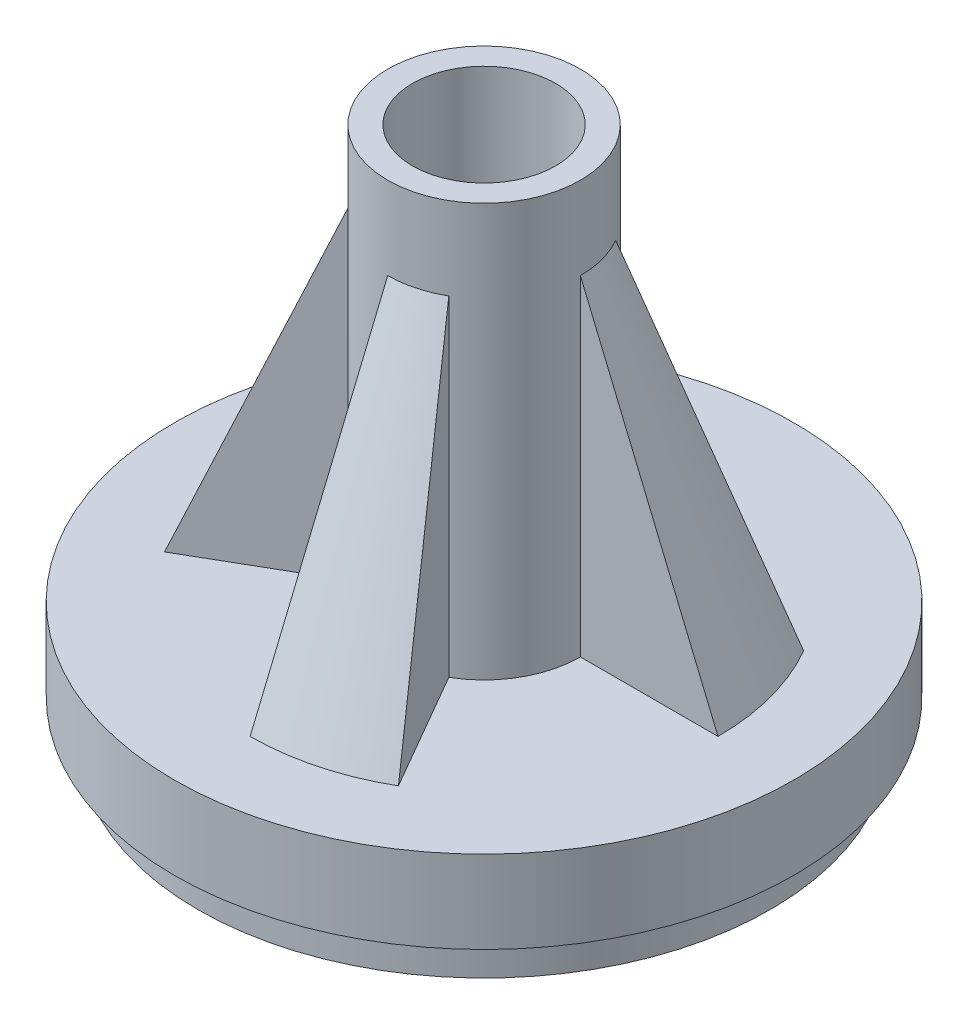
ISO-10303-21;
HEADER;
FILE_DESCRIPTION(('STEP AP214'),'2;1');
FILE_NAME('part.step','',(''),(''),'','','');
FILE_SCHEMA(('AUTOMOTIVE_DESIGN { 1 0 10303 214 1 1 1 1 }'));
ENDSEC;
DATA;
#1=APPLICATION_CONTEXT('core data for automotive mechanical design processes');
#2=APPLICATION_PROTOCOL_DEFINITION('international standard','automotive_design',2000,#1);
#3=PRODUCT_CONTEXT('',#1,'mechanical');
#4=PRODUCT('Part','Part','',(#3));
#5=PRODUCT_RELATED_PRODUCT_CATEGORY('part','',(#4));
#6=PRODUCT_DEFINITION_FORMATION('','',#4);
#7=PRODUCT_DEFINITION_CONTEXT('part definition',#1,'design');
#8=PRODUCT_DEFINITION('design','',#6,#7);
#9=PRODUCT_DEFINITION_SHAPE('','',#8);
#10=(LENGTH_UNIT() NAMED_UNIT(*) SI_UNIT(.MILLI.,.METRE.));
#11=(NAMED_UNIT(*) PLANE_ANGLE_UNIT() SI_UNIT($,.RADIAN.));
#12=(NAMED_UNIT(*) SI_UNIT($,.STERADIAN.) SOLID_ANGLE_UNIT());
#13=UNCERTAINTY_MEASURE_WITH_UNIT(LENGTH_MEASURE(1.E-05),#10,'distance_accuracy_value','');
#14=(GEOMETRIC_REPRESENTATION_CONTEXT(3) GLOBAL_UNCERTAINTY_ASSIGNED_CONTEXT((#13)) GLOBAL_UNIT_ASSIGNED_CONTEXT((#10,
#11,#12)) REPRESENTATION_CONTEXT('',''));
#15=CARTESIAN_POINT('',(0.,0.,0.));
#16=DIRECTION('',(0.,0.,1.));
#17=DIRECTION('',(1.,0.,0.));
#18=AXIS2_PLACEMENT_3D('',#15,#16,#17);
#19=CARTESIAN_POINT('',(0.,4.5,0.));
#20=DIRECTION('',(0.,1.,0.));
#21=DIRECTION('',(0.,0.,1.));
#22=AXIS2_PLACEMENT_3D('',#19,#20,#21);
#23=PLANE('',#22);
#24=CARTESIAN_POINT('',(0.,4.5,0.));
#25=DIRECTION('',(0.,1.,0.));
#26=DIRECTION('',(0.,0.,1.));
#27=AXIS2_PLACEMENT_3D('',#24,#25,#26);
#28=CIRCLE('',#27,11.25);
#29=CARTESIAN_POINT('',(0.,4.5,11.25));
#30=VERTEX_POINT('',#29);
#31=EDGE_CURVE('E185',#30,#30,#28,.T.);
#32=ORIENTED_EDGE('',*,*,#31,.T.);
#33=EDGE_LOOP('',(#32));
#34=FACE_BOUND('',#33,.T.);
#35=CARTESIAN_POINT('',(0.,4.5,0.));
#36=DIRECTION('',(0.,1.,0.));
#37=DIRECTION('',(0.,0.,1.));
#38=AXIS2_PLACEMENT_3D('',#35,#36,#37);
#39=CIRCLE('',#38,3.5);
#40=CARTESIAN_POINT('',(3.03108891324553,4.5,-1.75));
#41=VERTEX_POINT('',#40);
#42=CARTESIAN_POINT('',(0.,4.5,-3.5));
#43=VERTEX_POINT('',#42);
#44=EDGE_CURVE('E160',#41,#43,#39,.T.);
#45=ORIENTED_EDGE('',*,*,#44,.F.);
#46=DIRECTION('',(0.866025403784438,0.,-0.500000000000001));
#47=VECTOR('',#46,1.);
#48=CARTESIAN_POINT('',(3.03108891324553,4.5,-1.75));
#49=LINE('',#48,#47);
#50=CARTESIAN_POINT('',(7.36121593216772,4.5,-4.25000000000001));
#51=VERTEX_POINT('',#50);
#52=EDGE_CURVE('E416',#41,#51,#49,.T.);
#53=ORIENTED_EDGE('',*,*,#52,.T.);
#54=CARTESIAN_POINT('',(0.,4.5,0.));
#55=DIRECTION('',(0.,-1.,0.));
#56=DIRECTION('',(0.,0.,-1.));
#57=AXIS2_PLACEMENT_3D('',#54,#55,#56);
#58=CIRCLE('',#57,8.5);
#59=CARTESIAN_POINT('',(8.5,4.5,0.));
#60=VERTEX_POINT('',#59);
#61=EDGE_CURVE('E153',#51,#60,#58,.T.);
#62=ORIENTED_EDGE('',*,*,#61,.T.);
#63=DIRECTION('',(1.,0.,0.));
#64=VECTOR('',#63,1.);
#65=CARTESIAN_POINT('',(3.5,4.5,0.));
#66=LINE('',#65,#64);
#67=CARTESIAN_POINT('',(3.5,4.5,0.));
#68=VERTEX_POINT('',#67);
#69=EDGE_CURVE('E138',#68,#60,#66,.T.);
#70=ORIENTED_EDGE('',*,*,#69,.F.);
#71=CARTESIAN_POINT('',(1.75,4.5,3.03108891324553));
#72=VERTEX_POINT('',#71);
#73=EDGE_CURVE('E150',#72,#68,#39,.T.);
#74=ORIENTED_EDGE('',*,*,#73,.F.);
#75=DIRECTION('',(-0.500000000000001,0.,-0.866025403784438));
#76=VECTOR('',#75,1.);
#77=CARTESIAN_POINT('',(0.,4.5,0.));
#78=LINE('',#77,#76);
#79=CARTESIAN_POINT('',(4.25000000000001,4.5,7.36121593216772));
#80=VERTEX_POINT('',#79);
#81=EDGE_CURVE('E470',#80,#72,#78,.T.);
#82=ORIENTED_EDGE('',*,*,#81,.F.);
#83=CARTESIAN_POINT('',(0.,4.5,0.));
#84=DIRECTION('',(0.,-1.,0.));
#85=DIRECTION('',(0.,0.,-1.));
#86=AXIS2_PLACEMENT_3D('',#83,#84,#85);
#87=CIRCLE('',#86,8.5);
#88=CARTESIAN_POINT('',(0.,4.5,8.5));
#89=VERTEX_POINT('',#88);
#90=EDGE_CURVE('E476',#80,#89,#87,.T.);
#91=ORIENTED_EDGE('',*,*,#90,.T.);
#92=DIRECTION('',(0.,0.,-1.));
#93=VECTOR('',#92,1.);
#94=CARTESIAN_POINT('',(0.,4.5,0.));
#95=LINE('',#94,#93);
#96=CARTESIAN_POINT('',(0.,4.5,3.5));
#97=VERTEX_POINT('',#96);
#98=EDGE_CURVE('E421',#89,#97,#95,.T.);
#99=ORIENTED_EDGE('',*,*,#98,.T.);
#100=CARTESIAN_POINT('',(-3.03108891324553,4.5,1.75));
#101=VERTEX_POINT('',#100);
#102=EDGE_CURVE('E163',#101,#97,#39,.T.);
#103=ORIENTED_EDGE('',*,*,#102,.F.);
#104=DIRECTION('',(0.866025403784438,0.,-0.500000000000001));
#105=VECTOR('',#104,1.);
#106=CARTESIAN_POINT('',(-3.03108891324553,4.5,1.75));
#107=LINE('',#106,#105);
#108=CARTESIAN_POINT('',(-7.36121593216772,4.5,4.25000000000001));
#109=VERTEX_POINT('',#108);
#110=EDGE_CURVE('E62',#109,#101,#107,.T.);
#111=ORIENTED_EDGE('',*,*,#110,.F.);
#112=CARTESIAN_POINT('',(0.,4.5,0.));
#113=DIRECTION('',(0.,-1.,0.));
#114=DIRECTION('',(0.,0.,-1.));
#115=AXIS2_PLACEMENT_3D('',#112,#113,#114);
#116=CIRCLE('',#115,8.5);
#117=CARTESIAN_POINT('',(-8.5,4.5,0.));
#118=VERTEX_POINT('',#117);
#119=EDGE_CURVE('E66',#109,#118,#116,.T.);
#120=ORIENTED_EDGE('',*,*,#119,.T.);
#121=DIRECTION('',(1.,0.,0.));
#122=VECTOR('',#121,1.);
#123=CARTESIAN_POINT('',(-3.5,4.5,0.));
#124=LINE('',#123,#122);
#125=CARTESIAN_POINT('',(-3.5,4.5,0.));
#126=VERTEX_POINT('',#125);
#127=EDGE_CURVE('E425',#118,#126,#124,.T.);
#128=ORIENTED_EDGE('',*,*,#127,.T.);
#129=CARTESIAN_POINT('',(-1.75,4.5,-3.03108891324553));
#130=VERTEX_POINT('',#129);
#131=EDGE_CURVE('E162',#130,#126,#39,.T.);
#132=ORIENTED_EDGE('',*,*,#131,.F.);
#133=DIRECTION('',(0.500000000000001,0.,0.866025403784438));
#134=VECTOR('',#133,1.);
#135=CARTESIAN_POINT('',(0.,4.5,0.));
#136=LINE('',#135,#134);
#137=CARTESIAN_POINT('',(-4.25000000000001,4.5,-7.36121593216773));
#138=VERTEX_POINT('',#137);
#139=EDGE_CURVE('E454',#138,#130,#136,.T.);
#140=ORIENTED_EDGE('',*,*,#139,.F.);
#141=CARTESIAN_POINT('',(0.,4.5,0.));
#142=DIRECTION('',(0.,-1.,0.));
#143=DIRECTION('',(0.,0.,-1.));
#144=AXIS2_PLACEMENT_3D('',#141,#142,#143);
#145=CIRCLE('',#144,8.5);
#146=CARTESIAN_POINT('',(0.,4.5,-8.5));
#147=VERTEX_POINT('',#146);
#148=EDGE_CURVE('E177',#138,#147,#145,.T.);
#149=ORIENTED_EDGE('',*,*,#148,.T.);
#150=DIRECTION('',(0.,0.,1.));
#151=VECTOR('',#150,1.);
#152=CARTESIAN_POINT('',(0.,4.5,0.));
#153=LINE('',#152,#151);
#154=EDGE_CURVE('E445',#147,#43,#153,.T.);
#155=ORIENTED_EDGE('',*,*,#154,.T.);
#156=EDGE_LOOP('',(#45,#53,#62,#70,#74,#82,#91,#99,#103,#111,#120,#128,#132,#140,#149,#155));
#157=FACE_BOUND('',#156,.T.);
#158=ADVANCED_FACE('F47',(#34,#157),#23,.T.);
#159=CARTESIAN_POINT('',(0.,19.5,0.));
#160=DIRECTION('',(0.,-1.,0.));
#161=DIRECTION('',(0.,0.,-1.));
#162=AXIS2_PLACEMENT_3D('',#159,#160,#161);
#163=CYLINDRICAL_SURFACE('',#162,3.5);
#164=CARTESIAN_POINT('',(0.,19.5,0.));
#165=DIRECTION('',(0.,1.,0.));
#166=DIRECTION('',(0.,0.,1.));
#167=AXIS2_PLACEMENT_3D('',#164,#165,#166);
#168=CIRCLE('',#167,3.5);
#169=CARTESIAN_POINT('',(0.,19.5,3.5));
#170=VERTEX_POINT('',#169);
#171=EDGE_CURVE('E165',#170,#170,#168,.T.);
#172=ORIENTED_EDGE('',*,*,#171,.F.);
#173=EDGE_LOOP('',(#172));
#174=FACE_BOUND('',#173,.T.);
#175=DIRECTION('',(0.,-1.,0.));
#176=VECTOR('',#175,1.);
#177=CARTESIAN_POINT('',(3.03108891324553,16.5,-1.75));
#178=LINE('',#177,#176);
#179=CARTESIAN_POINT('',(3.03108891324553,16.5,-1.75));
#180=VERTEX_POINT('',#179);
#181=EDGE_CURVE('E413',#180,#41,#178,.T.);
#182=ORIENTED_EDGE('',*,*,#181,.T.);
#183=ORIENTED_EDGE('',*,*,#44,.T.);
#184=DIRECTION('',(0.,1.,0.));
#185=VECTOR('',#184,1.);
#186=CARTESIAN_POINT('',(0.,0.,-3.5));
#187=LINE('',#186,#185);
#188=CARTESIAN_POINT('',(0.,16.5,-3.5));
#189=VERTEX_POINT('',#188);
#190=EDGE_CURVE('E442',#43,#189,#187,.T.);
#191=ORIENTED_EDGE('',*,*,#190,.T.);
#192=CARTESIAN_POINT('',(0.,16.5,0.));
#193=DIRECTION('',(0.,-1.,0.));
#194=DIRECTION('',(0.,0.,-1.));
#195=AXIS2_PLACEMENT_3D('',#192,#193,#194);
#196=CIRCLE('',#195,3.5);
#197=CARTESIAN_POINT('',(-1.75,16.5,-3.03108891324553));
#198=VERTEX_POINT('',#197);
#199=EDGE_CURVE('E459',#198,#189,#196,.T.);
#200=ORIENTED_EDGE('',*,*,#199,.F.);
#201=DIRECTION('',(0.,1.,0.));
#202=VECTOR('',#201,1.);
#203=CARTESIAN_POINT('',(-1.75,0.,-3.03108891324553));
#204=LINE('',#203,#202);
#205=EDGE_CURVE('E452',#130,#198,#204,.T.);
#206=ORIENTED_EDGE('',*,*,#205,.F.);
#207=ORIENTED_EDGE('',*,*,#131,.T.);
#208=DIRECTION('',(0.,1.,0.));
#209=VECTOR('',#208,1.);
#210=CARTESIAN_POINT('',(-3.5,16.5,0.));
#211=LINE('',#210,#209);
#212=CARTESIAN_POINT('',(-3.5,16.5,0.));
#213=VERTEX_POINT('',#212);
#214=EDGE_CURVE('E427',#126,#213,#211,.T.);
#215=ORIENTED_EDGE('',*,*,#214,.T.);
#216=CARTESIAN_POINT('',(0.,16.5,0.));
#217=DIRECTION('',(0.,-1.,0.));
#218=DIRECTION('',(0.,0.,-1.));
#219=AXIS2_PLACEMENT_3D('',#216,#217,#218);
#220=CIRCLE('',#219,3.5);
#221=CARTESIAN_POINT('',(-3.03108891324553,16.5,1.75));
#222=VERTEX_POINT('',#221);
#223=EDGE_CURVE('E145',#222,#213,#220,.T.);
#224=ORIENTED_EDGE('',*,*,#223,.F.);
#225=DIRECTION('',(0.,1.,0.));
#226=VECTOR('',#225,1.);
#227=CARTESIAN_POINT('',(-3.03108891324553,16.5,1.75));
#228=LINE('',#227,#226);
#229=EDGE_CURVE('E433',#101,#222,#228,.T.);
#230=ORIENTED_EDGE('',*,*,#229,.F.);
#231=ORIENTED_EDGE('',*,*,#102,.T.);
#232=DIRECTION('',(0.,1.,0.));
#233=VECTOR('',#232,1.);
#234=CARTESIAN_POINT('',(0.,0.,3.5));
#235=LINE('',#234,#233);
#236=CARTESIAN_POINT('',(0.,16.5,3.5));
#237=VERTEX_POINT('',#236);
#238=EDGE_CURVE('E465',#97,#237,#235,.T.);
#239=ORIENTED_EDGE('',*,*,#238,.T.);
#240=CARTESIAN_POINT('',(0.,16.5,0.));
#241=DIRECTION('',(0.,-1.,0.));
#242=DIRECTION('',(0.,0.,-1.));
#243=AXIS2_PLACEMENT_3D('',#240,#241,#242);
#244=CIRCLE('',#243,3.5);
#245=CARTESIAN_POINT('',(1.75,16.5,3.03108891324553));
#246=VERTEX_POINT('',#245);
#247=EDGE_CURVE('E446',#246,#237,#244,.T.);
#248=ORIENTED_EDGE('',*,*,#247,.F.);
#249=DIRECTION('',(0.,1.,0.));
#250=VECTOR('',#249,1.);
#251=CARTESIAN_POINT('',(1.75,0.,3.03108891324553));
#252=LINE('',#251,#250);
#253=EDGE_CURVE('E158',#72,#246,#252,.T.);
#254=ORIENTED_EDGE('',*,*,#253,.F.);
#255=ORIENTED_EDGE('',*,*,#73,.T.);
#256=DIRECTION('',(0.,-1.,0.));
#257=VECTOR('',#256,1.);
#258=CARTESIAN_POINT('',(3.5,16.5,0.));
#259=LINE('',#258,#257);
#260=CARTESIAN_POINT('',(3.5,16.5,0.));
#261=VERTEX_POINT('',#260);
#262=EDGE_CURVE('E135',#261,#68,#259,.T.);
#263=ORIENTED_EDGE('',*,*,#262,.F.);
#264=CARTESIAN_POINT('',(0.,16.5,0.));
#265=DIRECTION('',(0.,-1.,0.));
#266=DIRECTION('',(0.,0.,-1.));
#267=AXIS2_PLACEMENT_3D('',#264,#265,#266);
#268=CIRCLE('',#267,3.5);
#269=EDGE_CURVE('E418',#180,#261,#268,.T.);
#270=ORIENTED_EDGE('',*,*,#269,.F.);
#271=EDGE_LOOP('',(#182,#183,#191,#200,#206,#207,#215,#224,#230,#231,#239,#248,#254,#255,#263,#270));
#272=FACE_BOUND('',#271,.T.);
#273=ADVANCED_FACE('F156',(#174,#272),#163,.T.);
#274=CARTESIAN_POINT('',(0.,1.5,0.));
#275=DIRECTION('',(0.,-1.,0.));
#276=DIRECTION('',(0.,0.,-1.));
#277=AXIS2_PLACEMENT_3D('',#274,#275,#276);
#278=CYLINDRICAL_SURFACE('',#277,10.4);
#279=CARTESIAN_POINT('',(0.,1.5,0.));
#280=DIRECTION('',(0.,1.,0.));
#281=DIRECTION('',(0.,0.,1.));
#282=AXIS2_PLACEMENT_3D('',#279,#280,#281);
#283=CIRCLE('',#282,10.4);
#284=CARTESIAN_POINT('',(0.,1.5,10.4));
#285=VERTEX_POINT('',#284);
#286=EDGE_CURVE('E55',#285,#285,#283,.T.);
#287=ORIENTED_EDGE('',*,*,#286,.F.);
#288=EDGE_LOOP('',(#287));
#289=FACE_BOUND('',#288,.T.);
#290=CARTESIAN_POINT('',(0.,0.,0.));
#291=DIRECTION('',(0.,1.,0.));
#292=DIRECTION('',(0.,0.,1.));
#293=AXIS2_PLACEMENT_3D('',#290,#291,#292);
#294=CIRCLE('',#293,10.4);
#295=CARTESIAN_POINT('',(0.,0.,10.4));
#296=VERTEX_POINT('',#295);
#297=EDGE_CURVE('E190',#296,#296,#294,.T.);
#298=ORIENTED_EDGE('',*,*,#297,.T.);
#299=EDGE_LOOP('',(#298));
#300=FACE_BOUND('',#299,.T.);
#301=ADVANCED_FACE('F49',(#289,#300),#278,.T.);
#302=CARTESIAN_POINT('',(0.,0.,0.));
#303=DIRECTION('',(0.,1.,0.));
#304=DIRECTION('',(0.,0.,1.));
#305=AXIS2_PLACEMENT_3D('',#302,#303,#304);
#306=PLANE('',#305);
#307=CARTESIAN_POINT('',(0.,0.,0.));
#308=DIRECTION('',(0.,1.,0.));
#309=DIRECTION('',(0.,0.,1.));
#310=AXIS2_PLACEMENT_3D('',#307,#308,#309);
#311=CIRCLE('',#310,1.1);
#312=CARTESIAN_POINT('',(0.,0.,1.1));
#313=VERTEX_POINT('',#312);
#314=EDGE_CURVE('E169',#313,#313,#311,.F.);
#315=ORIENTED_EDGE('',*,*,#314,.F.);
#316=EDGE_LOOP('',(#315));
#317=FACE_BOUND('',#316,.T.);
#318=ORIENTED_EDGE('',*,*,#297,.F.);
#319=EDGE_LOOP('',(#318));
#320=FACE_BOUND('',#319,.T.);
#321=ADVANCED_FACE('F197',(#317,#320),#306,.F.);
#322=CARTESIAN_POINT('',(0.,4.5,0.));
#323=DIRECTION('',(0.,-1.,0.));
#324=DIRECTION('',(0.,0.,-1.));
#325=AXIS2_PLACEMENT_3D('',#322,#323,#324);
#326=CYLINDRICAL_SURFACE('',#325,11.25);
#327=ORIENTED_EDGE('',*,*,#31,.F.);
#328=EDGE_LOOP('',(#327));
#329=FACE_BOUND('',#328,.T.);
#330=CARTESIAN_POINT('',(0.,1.5,0.));
#331=DIRECTION('',(0.,1.,0.));
#332=DIRECTION('',(0.,0.,1.));
#333=AXIS2_PLACEMENT_3D('',#330,#331,#332);
#334=CIRCLE('',#333,11.25);
#335=CARTESIAN_POINT('',(0.,1.5,11.25));
#336=VERTEX_POINT('',#335);
#337=EDGE_CURVE('E181',#336,#336,#334,.T.);
#338=ORIENTED_EDGE('',*,*,#337,.T.);
#339=EDGE_LOOP('',(#338));
#340=FACE_BOUND('',#339,.T.);
#341=ADVANCED_FACE('F199',(#329,#340),#326,.T.);
#342=CARTESIAN_POINT('',(0.,1.5,0.));
#343=DIRECTION('',(0.,1.,0.));
#344=DIRECTION('',(0.,0.,1.));
#345=AXIS2_PLACEMENT_3D('',#342,#343,#344);
#346=PLANE('',#345);
#347=ORIENTED_EDGE('',*,*,#286,.T.);
#348=EDGE_LOOP('',(#347));
#349=FACE_BOUND('',#348,.T.);
#350=ORIENTED_EDGE('',*,*,#337,.F.);
#351=EDGE_LOOP('',(#350));
#352=FACE_BOUND('',#351,.T.);
#353=ADVANCED_FACE('F206',(#349,#352),#346,.F.);
#354=CARTESIAN_POINT('',(0.,19.5,0.));
#355=DIRECTION('',(0.,-1.,0.));
#356=DIRECTION('',(0.,0.,-1.));
#357=AXIS2_PLACEMENT_3D('',#354,#355,#356);
#358=CYLINDRICAL_SURFACE('',#357,2.6);
#359=CARTESIAN_POINT('',(0.,19.5,0.));
#360=DIRECTION('',(0.,1.,0.));
#361=DIRECTION('',(0.,0.,1.));
#362=AXIS2_PLACEMENT_3D('',#359,#360,#361);
#363=CIRCLE('',#362,2.6);
#364=CARTESIAN_POINT('',(0.,19.5,2.6));
#365=VERTEX_POINT('',#364);
#366=EDGE_CURVE('E159',#365,#365,#363,.T.);
#367=ORIENTED_EDGE('',*,*,#366,.T.);
#368=EDGE_LOOP('',(#367));
#369=FACE_BOUND('',#368,.T.);
#370=CARTESIAN_POINT('',(0.,4.5,0.));
#371=DIRECTION('',(0.,1.,0.));
#372=DIRECTION('',(0.,0.,1.));
#373=AXIS2_PLACEMENT_3D('',#370,#371,#372);
#374=CIRCLE('',#373,2.6);
#375=CARTESIAN_POINT('',(0.,4.5,2.6));
#376=VERTEX_POINT('',#375);
#377=EDGE_CURVE('E11',#376,#376,#374,.F.);
#378=ORIENTED_EDGE('',*,*,#377,.T.);
#379=EDGE_LOOP('',(#378));
#380=FACE_BOUND('',#379,.T.);
#381=ADVANCED_FACE('F231',(#369,#380),#358,.F.);
#382=CARTESIAN_POINT('',(0.,19.5,0.));
#383=DIRECTION('',(0.,1.,0.));
#384=DIRECTION('',(0.,0.,1.));
#385=AXIS2_PLACEMENT_3D('',#382,#383,#384);
#386=PLANE('',#385);
#387=ORIENTED_EDGE('',*,*,#366,.F.);
#388=EDGE_LOOP('',(#387));
#389=FACE_BOUND('',#388,.T.);
#390=ORIENTED_EDGE('',*,*,#171,.T.);
#391=EDGE_LOOP('',(#390));
#392=FACE_BOUND('',#391,.T.);
#393=ADVANCED_FACE('F224',(#389,#392),#386,.T.);
#394=CARTESIAN_POINT('',(0.,4.5,0.));
#395=DIRECTION('',(0.,1.,0.));
#396=DIRECTION('',(0.,0.,1.));
#397=AXIS2_PLACEMENT_3D('',#394,#395,#396);
#398=CIRCLE('',#397,1.1);
#399=CARTESIAN_POINT('',(0.,4.5,1.1));
#400=VERTEX_POINT('',#399);
#401=EDGE_CURVE('E172',#400,#400,#398,.T.);
#402=ORIENTED_EDGE('',*,*,#401,.F.);
#403=EDGE_LOOP('',(#402));
#404=FACE_BOUND('',#403,.T.);
#405=ORIENTED_EDGE('',*,*,#377,.F.);
#406=EDGE_LOOP('',(#405));
#407=FACE_BOUND('',#406,.T.);
#408=ADVANCED_FACE('F214',(#404,#407),#23,.T.);
#409=CARTESIAN_POINT('',(0.,-3.11126983722081,0.));
#410=DIRECTION('',(0.,1.,0.));
#411=DIRECTION('',(0.,0.,1.));
#412=AXIS2_PLACEMENT_3D('',#409,#410,#411);
#413=CYLINDRICAL_SURFACE('',#412,1.1);
#414=ORIENTED_EDGE('',*,*,#314,.T.);
#415=EDGE_LOOP('',(#414));
#416=FACE_BOUND('',#415,.T.);
#417=ORIENTED_EDGE('',*,*,#401,.T.);
#418=EDGE_LOOP('',(#417));
#419=FACE_BOUND('',#418,.T.);
#420=ADVANCED_FACE('F223',(#416,#419),#413,.F.);
#421=CARTESIAN_POINT('',(0.,16.5,0.));
#422=DIRECTION('',(0.,-1.,0.));
#423=DIRECTION('',(0.,0.,-1.));
#424=AXIS2_PLACEMENT_3D('',#421,#422,#423);
#425=CONICAL_SURFACE('',#424,3.5,0.394791119699762);
#426=DIRECTION('',(0.192307692307693,-0.923076923076923,0.333086693763246));
#427=VECTOR('',#426,1.);
#428=CARTESIAN_POINT('',(4.42011834319527,3.68343195266273,7.65586954588136));
#429=LINE('',#428,#427);
#430=EDGE_CURVE('E473',#246,#80,#429,.T.);
#431=ORIENTED_EDGE('',*,*,#430,.F.);
#432=ORIENTED_EDGE('',*,*,#247,.T.);
#433=DIRECTION('',(0.,-0.923076923076923,0.384615384615385));
#434=VECTOR('',#433,1.);
#435=CARTESIAN_POINT('',(0.,3.68343195266273,8.84023668639053));
#436=LINE('',#435,#434);
#437=EDGE_CURVE('E467',#237,#89,#436,.T.);
#438=ORIENTED_EDGE('',*,*,#437,.T.);
#439=ORIENTED_EDGE('',*,*,#90,.F.);
#440=EDGE_LOOP('',(#431,#432,#438,#439));
#441=FACE_BOUND('',#440,.T.);
#442=ADVANCED_FACE('F229',(#441),#425,.T.);
#443=CARTESIAN_POINT('',(0.,0.,0.));
#444=DIRECTION('',(0.866025403784438,0.,-0.500000000000001));
#445=DIRECTION('',(-0.500000000000001,0.,-0.866025403784438));
#446=AXIS2_PLACEMENT_3D('',#443,#444,#445);
#447=PLANE('',#446);
#448=ORIENTED_EDGE('',*,*,#81,.T.);
#449=ORIENTED_EDGE('',*,*,#253,.T.);
#450=ORIENTED_EDGE('',*,*,#430,.T.);
#451=EDGE_LOOP('',(#448,#449,#450));
#452=FACE_BOUND('',#451,.T.);
#453=ADVANCED_FACE('F247',(#452),#447,.T.);
#454=CARTESIAN_POINT('',(0.,0.,0.));
#455=DIRECTION('',(1.,0.,0.));
#456=DIRECTION('',(0.,0.,-1.));
#457=AXIS2_PLACEMENT_3D('',#454,#455,#456);
#458=PLANE('',#457);
#459=ORIENTED_EDGE('',*,*,#98,.F.);
#460=ORIENTED_EDGE('',*,*,#437,.F.);
#461=ORIENTED_EDGE('',*,*,#238,.F.);
#462=EDGE_LOOP('',(#459,#460,#461));
#463=FACE_BOUND('',#462,.T.);
#464=ADVANCED_FACE('F251',(#463),#458,.F.);
#465=CARTESIAN_POINT('',(0.,16.5,0.));
#466=DIRECTION('',(0.,-1.,0.));
#467=DIRECTION('',(0.,0.,-1.));
#468=AXIS2_PLACEMENT_3D('',#465,#466,#467);
#469=CONICAL_SURFACE('',#468,3.5,0.394791119699762);
#470=DIRECTION('',(-0.192307692307693,-0.923076923076923,-0.333086693763246));
#471=VECTOR('',#470,1.);
#472=CARTESIAN_POINT('',(-4.42011834319528,3.68343195266272,-7.65586954588137));
#473=LINE('',#472,#471);
#474=EDGE_CURVE('E456',#198,#138,#473,.T.);
#475=ORIENTED_EDGE('',*,*,#474,.F.);
#476=ORIENTED_EDGE('',*,*,#199,.T.);
#477=DIRECTION('',(0.,-0.923076923076923,-0.384615384615385));
#478=VECTOR('',#477,1.);
#479=CARTESIAN_POINT('',(0.,3.68343195266272,-8.84023668639053));
#480=LINE('',#479,#478);
#481=EDGE_CURVE('E449',#189,#147,#480,.T.);
#482=ORIENTED_EDGE('',*,*,#481,.T.);
#483=ORIENTED_EDGE('',*,*,#148,.F.);
#484=EDGE_LOOP('',(#475,#476,#482,#483));
#485=FACE_BOUND('',#484,.T.);
#486=ADVANCED_FACE('F255',(#485),#469,.T.);
#487=CARTESIAN_POINT('',(0.,0.,0.));
#488=DIRECTION('',(0.866025403784438,0.,-0.500000000000001));
#489=DIRECTION('',(-0.500000000000001,0.,-0.866025403784438));
#490=AXIS2_PLACEMENT_3D('',#487,#488,#489);
#491=PLANE('',#490);
#492=ORIENTED_EDGE('',*,*,#205,.T.);
#493=ORIENTED_EDGE('',*,*,#474,.T.);
#494=ORIENTED_EDGE('',*,*,#139,.T.);
#495=EDGE_LOOP('',(#492,#493,#494));
#496=FACE_BOUND('',#495,.T.);
#497=ADVANCED_FACE('F259',(#496),#491,.F.);
#498=CARTESIAN_POINT('',(0.,0.,0.));
#499=DIRECTION('',(1.,0.,0.));
#500=DIRECTION('',(0.,0.,-1.));
#501=AXIS2_PLACEMENT_3D('',#498,#499,#500);
#502=PLANE('',#501);
#503=ORIENTED_EDGE('',*,*,#190,.F.);
#504=ORIENTED_EDGE('',*,*,#154,.F.);
#505=ORIENTED_EDGE('',*,*,#481,.F.);
#506=EDGE_LOOP('',(#503,#504,#505));
#507=FACE_BOUND('',#506,.T.);
#508=ADVANCED_FACE('F263',(#507),#502,.T.);
#509=CARTESIAN_POINT('',(0.,16.5,0.));
#510=DIRECTION('',(0.,-1.,0.));
#511=DIRECTION('',(0.,0.,-1.));
#512=AXIS2_PLACEMENT_3D('',#509,#510,#511);
#513=CONICAL_SURFACE('',#512,3.5,0.394791119699762);
#514=DIRECTION('',(-0.333086693763246,-0.923076923076923,0.192307692307693));
#515=VECTOR('',#514,1.);
#516=CARTESIAN_POINT('',(-7.36121593216772,4.5,4.25000000000001));
#517=LINE('',#516,#515);
#518=EDGE_CURVE('E436',#222,#109,#517,.T.);
#519=ORIENTED_EDGE('',*,*,#518,.F.);
#520=ORIENTED_EDGE('',*,*,#223,.T.);
#521=DIRECTION('',(-0.384615384615385,-0.923076923076923,0.));
#522=VECTOR('',#521,1.);
#523=CARTESIAN_POINT('',(-8.5,4.5,0.));
#524=LINE('',#523,#522);
#525=EDGE_CURVE('E429',#213,#118,#524,.T.);
#526=ORIENTED_EDGE('',*,*,#525,.T.);
#527=ORIENTED_EDGE('',*,*,#119,.F.);
#528=EDGE_LOOP('',(#519,#520,#526,#527));
#529=FACE_BOUND('',#528,.T.);
#530=ADVANCED_FACE('F266',(#529),#513,.T.);
#531=CARTESIAN_POINT('',(0.,0.,0.));
#532=DIRECTION('',(0.500000000000001,0.,0.866025403784438));
#533=DIRECTION('',(0.866025403784438,0.,-0.500000000000001));
#534=AXIS2_PLACEMENT_3D('',#531,#532,#533);
#535=PLANE('',#534);
#536=ORIENTED_EDGE('',*,*,#110,.T.);
#537=ORIENTED_EDGE('',*,*,#229,.T.);
#538=ORIENTED_EDGE('',*,*,#518,.T.);
#539=EDGE_LOOP('',(#536,#537,#538));
#540=FACE_BOUND('',#539,.T.);
#541=ADVANCED_FACE('F270',(#540),#535,.T.);
#542=CARTESIAN_POINT('',(0.,0.,0.));
#543=DIRECTION('',(0.,0.,1.));
#544=DIRECTION('',(1.,0.,0.));
#545=AXIS2_PLACEMENT_3D('',#542,#543,#544);
#546=PLANE('',#545);
#547=ORIENTED_EDGE('',*,*,#127,.F.);
#548=ORIENTED_EDGE('',*,*,#525,.F.);
#549=ORIENTED_EDGE('',*,*,#214,.F.);
#550=EDGE_LOOP('',(#547,#548,#549));
#551=FACE_BOUND('',#550,.T.);
#552=ADVANCED_FACE('F274',(#551),#546,.F.);
#553=CARTESIAN_POINT('',(0.,4.5,0.));
#554=DIRECTION('',(0.,-1.,0.));
#555=DIRECTION('',(0.,0.,-1.));
#556=AXIS2_PLACEMENT_3D('',#553,#554,#555);
#557=CONICAL_SURFACE('',#556,8.5,0.394791119699762);
#558=DIRECTION('',(-0.333086693763245,0.923076923076923,0.192307692307693));
#559=VECTOR('',#558,1.);
#560=CARTESIAN_POINT('',(7.36121593216772,4.5,-4.25000000000001));
#561=LINE('',#560,#559);
#562=EDGE_CURVE('E415',#51,#180,#561,.T.);
#563=ORIENTED_EDGE('',*,*,#562,.T.);
#564=ORIENTED_EDGE('',*,*,#269,.T.);
#565=DIRECTION('',(-0.384615384615385,0.923076923076923,0.));
#566=VECTOR('',#565,1.);
#567=CARTESIAN_POINT('',(8.5,4.5,0.));
#568=LINE('',#567,#566);
#569=EDGE_CURVE('E140',#60,#261,#568,.T.);
#570=ORIENTED_EDGE('',*,*,#569,.F.);
#571=ORIENTED_EDGE('',*,*,#61,.F.);
#572=EDGE_LOOP('',(#563,#564,#570,#571));
#573=FACE_BOUND('',#572,.T.);
#574=ADVANCED_FACE('F278',(#573),#557,.T.);
#575=CARTESIAN_POINT('',(0.,0.,0.));
#576=DIRECTION('',(0.500000000000001,0.,0.866025403784438));
#577=DIRECTION('',(0.866025403784438,0.,-0.500000000000001));
#578=AXIS2_PLACEMENT_3D('',#575,#576,#577);
#579=PLANE('',#578);
#580=ORIENTED_EDGE('',*,*,#181,.F.);
#581=ORIENTED_EDGE('',*,*,#562,.F.);
#582=ORIENTED_EDGE('',*,*,#52,.F.);
#583=EDGE_LOOP('',(#580,#581,#582));
#584=FACE_BOUND('',#583,.T.);
#585=ADVANCED_FACE('F282',(#584),#579,.F.);
#586=CARTESIAN_POINT('',(0.,0.,0.));
#587=DIRECTION('',(0.,0.,1.));
#588=DIRECTION('',(1.,0.,0.));
#589=AXIS2_PLACEMENT_3D('',#586,#587,#588);
#590=PLANE('',#589);
#591=ORIENTED_EDGE('',*,*,#262,.T.);
#592=ORIENTED_EDGE('',*,*,#69,.T.);
#593=ORIENTED_EDGE('',*,*,#569,.T.);
#594=EDGE_LOOP('',(#591,#592,#593));
#595=FACE_BOUND('',#594,.T.);
#596=ADVANCED_FACE('F137',(#595),#590,.T.);
#597=CLOSED_SHELL('',(#158,#273,#301,#321,#341,#353,#381,#393,#408,#420,#442,#453,#464,#486,
#497,#508,#530,#541,#552,#574,#585,#596));
#598=MANIFOLD_SOLID_BREP('B2',#597);
#599=ADVANCED_BREP_SHAPE_REPRESENTATION('',(#18,#598),#14);
#600=SHAPE_DEFINITION_REPRESENTATION(#9,#599);
ENDSEC;
END-ISO-10303-21;
